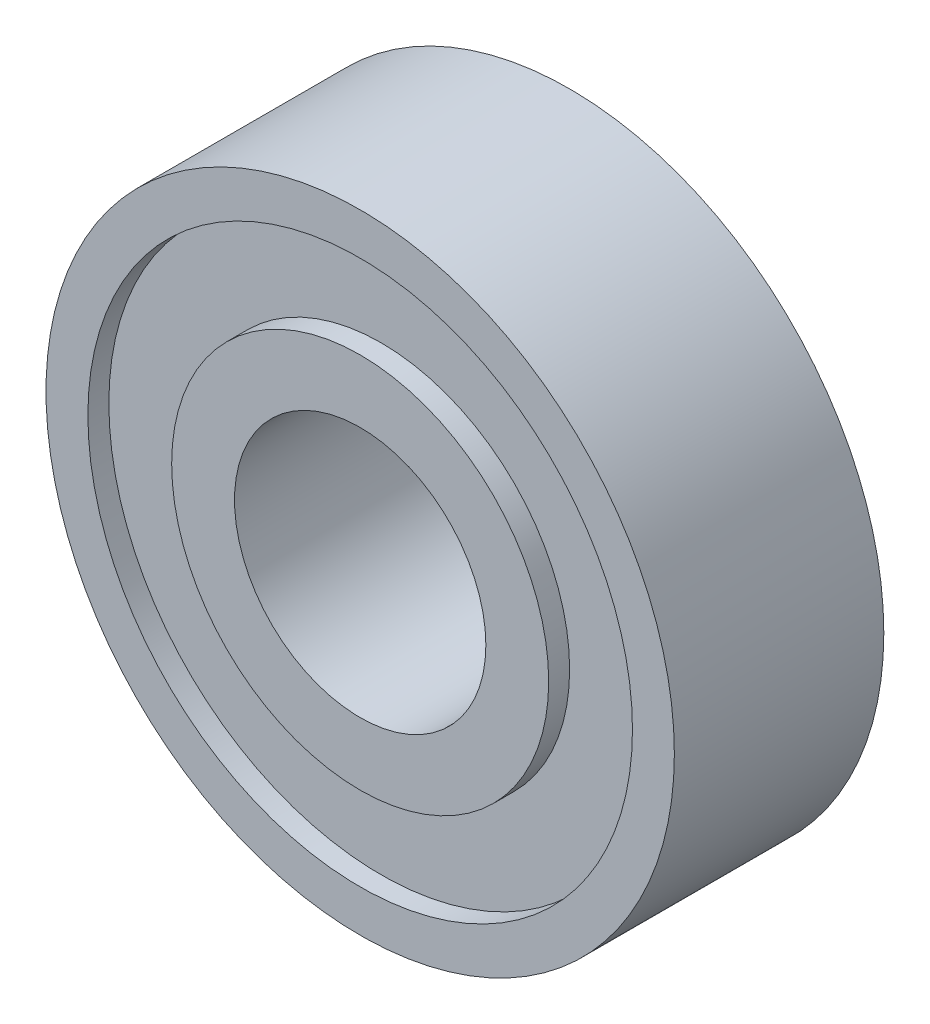
ISO-10303-21;
HEADER;
FILE_DESCRIPTION(('STEP AP214'),'2;1');
FILE_NAME('part.step','',(''),(''),'','','');
FILE_SCHEMA(('AUTOMOTIVE_DESIGN { 1 0 10303 214 1 1 1 1 }'));
ENDSEC;
DATA;
#1=APPLICATION_CONTEXT('core data for automotive mechanical design processes');
#2=APPLICATION_PROTOCOL_DEFINITION('international standard','automotive_design',2000,#1);
#3=PRODUCT_CONTEXT('',#1,'mechanical');
#4=PRODUCT('Part','Part','',(#3));
#5=PRODUCT_RELATED_PRODUCT_CATEGORY('part','',(#4));
#6=PRODUCT_DEFINITION_FORMATION('','',#4);
#7=PRODUCT_DEFINITION_CONTEXT('part definition',#1,'design');
#8=PRODUCT_DEFINITION('design','',#6,#7);
#9=PRODUCT_DEFINITION_SHAPE('','',#8);
#10=(LENGTH_UNIT() NAMED_UNIT(*) SI_UNIT(.MILLI.,.METRE.));
#11=(NAMED_UNIT(*) PLANE_ANGLE_UNIT() SI_UNIT($,.RADIAN.));
#12=(NAMED_UNIT(*) SI_UNIT($,.STERADIAN.) SOLID_ANGLE_UNIT());
#13=UNCERTAINTY_MEASURE_WITH_UNIT(LENGTH_MEASURE(1.E-05),#10,'distance_accuracy_value','');
#14=(GEOMETRIC_REPRESENTATION_CONTEXT(3) GLOBAL_UNCERTAINTY_ASSIGNED_CONTEXT((#13)) GLOBAL_UNIT_ASSIGNED_CONTEXT((#10,
#11,#12)) REPRESENTATION_CONTEXT('',''));
#15=CARTESIAN_POINT('',(0.,0.,0.));
#16=DIRECTION('',(0.,0.,1.));
#17=DIRECTION('',(1.,0.,0.));
#18=AXIS2_PLACEMENT_3D('',#15,#16,#17);
#19=CARTESIAN_POINT('',(0.,0.,0.));
#20=DIRECTION('',(0.,0.,1.));
#21=DIRECTION('',(1.,0.,0.));
#22=AXIS2_PLACEMENT_3D('',#19,#20,#21);
#23=PLANE('',#22);
#24=CARTESIAN_POINT('',(0.,0.,0.));
#25=DIRECTION('',(0.,0.,1.));
#26=DIRECTION('',(1.,0.,0.));
#27=AXIS2_PLACEMENT_3D('',#24,#25,#26);
#28=CIRCLE('',#27,3.);
#29=CARTESIAN_POINT('',(3.,0.,0.));
#30=VERTEX_POINT('',#29);
#31=EDGE_CURVE('E64',#30,#30,#28,.T.);
#32=ORIENTED_EDGE('',*,*,#31,.T.);
#33=EDGE_LOOP('',(#32));
#34=FACE_BOUND('',#33,.T.);
#35=CARTESIAN_POINT('',(0.,0.,0.));
#36=DIRECTION('',(0.,0.,-1.));
#37=DIRECTION('',(-1.,0.,0.));
#38=AXIS2_PLACEMENT_3D('',#35,#36,#37);
#39=CIRCLE('',#38,4.5);
#40=CARTESIAN_POINT('',(-4.5,0.,0.));
#41=VERTEX_POINT('',#40);
#42=EDGE_CURVE('E96',#41,#41,#39,.T.);
#43=ORIENTED_EDGE('',*,*,#42,.T.);
#44=EDGE_LOOP('',(#43));
#45=FACE_BOUND('',#44,.T.);
#46=ADVANCED_FACE('F49',(#34,#45),#23,.F.);
#47=CARTESIAN_POINT('',(0.,0.,5.));
#48=DIRECTION('',(0.,0.,1.));
#49=DIRECTION('',(1.,0.,0.));
#50=AXIS2_PLACEMENT_3D('',#47,#48,#49);
#51=PLANE('',#50);
#52=CARTESIAN_POINT('',(0.,0.,5.));
#53=DIRECTION('',(0.,0.,1.));
#54=DIRECTION('',(1.,0.,0.));
#55=AXIS2_PLACEMENT_3D('',#52,#53,#54);
#56=CIRCLE('',#55,3.);
#57=CARTESIAN_POINT('',(3.,0.,5.));
#58=VERTEX_POINT('',#57);
#59=EDGE_CURVE('E62',#58,#58,#56,.T.);
#60=ORIENTED_EDGE('',*,*,#59,.F.);
#61=EDGE_LOOP('',(#60));
#62=FACE_BOUND('',#61,.T.);
#63=CARTESIAN_POINT('',(0.,0.,5.));
#64=DIRECTION('',(0.,0.,1.));
#65=DIRECTION('',(1.,0.,0.));
#66=AXIS2_PLACEMENT_3D('',#63,#64,#65);
#67=CIRCLE('',#66,4.5);
#68=CARTESIAN_POINT('',(4.5,0.,5.));
#69=VERTEX_POINT('',#68);
#70=EDGE_CURVE('E80',#69,#69,#67,.T.);
#71=ORIENTED_EDGE('',*,*,#70,.T.);
#72=EDGE_LOOP('',(#71));
#73=FACE_BOUND('',#72,.T.);
#74=ADVANCED_FACE('F136',(#62,#73),#51,.T.);
#75=CARTESIAN_POINT('',(0.,0.,5.));
#76=DIRECTION('',(0.,0.,1.));
#77=DIRECTION('',(1.,0.,0.));
#78=AXIS2_PLACEMENT_3D('',#75,#76,#77);
#79=CIRCLE('',#78,6.5);
#80=CARTESIAN_POINT('',(6.5,0.,5.));
#81=VERTEX_POINT('',#80);
#82=EDGE_CURVE('E72',#81,#81,#79,.T.);
#83=ORIENTED_EDGE('',*,*,#82,.F.);
#84=EDGE_LOOP('',(#83));
#85=FACE_BOUND('',#84,.T.);
#86=CARTESIAN_POINT('',(0.,0.,5.));
#87=DIRECTION('',(0.,0.,1.));
#88=DIRECTION('',(1.,0.,0.));
#89=AXIS2_PLACEMENT_3D('',#86,#87,#88);
#90=CIRCLE('',#89,7.5);
#91=CARTESIAN_POINT('',(7.5,0.,5.));
#92=VERTEX_POINT('',#91);
#93=EDGE_CURVE('E10',#92,#92,#90,.T.);
#94=ORIENTED_EDGE('',*,*,#93,.T.);
#95=EDGE_LOOP('',(#94));
#96=FACE_BOUND('',#95,.T.);
#97=ADVANCED_FACE('F123',(#85,#96),#51,.T.);
#98=CARTESIAN_POINT('',(0.,0.,0.));
#99=DIRECTION('',(0.,0.,-1.));
#100=DIRECTION('',(-1.,0.,0.));
#101=AXIS2_PLACEMENT_3D('',#98,#99,#100);
#102=CIRCLE('',#101,6.5);
#103=CARTESIAN_POINT('',(-6.5,0.,0.));
#104=VERTEX_POINT('',#103);
#105=EDGE_CURVE('E88',#104,#104,#102,.T.);
#106=ORIENTED_EDGE('',*,*,#105,.F.);
#107=EDGE_LOOP('',(#106));
#108=FACE_BOUND('',#107,.T.);
#109=CARTESIAN_POINT('',(0.,0.,0.));
#110=DIRECTION('',(0.,0.,1.));
#111=DIRECTION('',(1.,0.,0.));
#112=AXIS2_PLACEMENT_3D('',#109,#110,#111);
#113=CIRCLE('',#112,7.5);
#114=CARTESIAN_POINT('',(7.5,0.,0.));
#115=VERTEX_POINT('',#114);
#116=EDGE_CURVE('E53',#115,#115,#113,.T.);
#117=ORIENTED_EDGE('',*,*,#116,.F.);
#118=EDGE_LOOP('',(#117));
#119=FACE_BOUND('',#118,.T.);
#120=ADVANCED_FACE('F120',(#108,#119),#23,.F.);
#121=CARTESIAN_POINT('',(0.,0.,5.));
#122=DIRECTION('',(0.,0.,-1.));
#123=DIRECTION('',(-1.,0.,0.));
#124=AXIS2_PLACEMENT_3D('',#121,#122,#123);
#125=CYLINDRICAL_SURFACE('',#124,7.5);
#126=ORIENTED_EDGE('',*,*,#93,.F.);
#127=EDGE_LOOP('',(#126));
#128=FACE_BOUND('',#127,.T.);
#129=ORIENTED_EDGE('',*,*,#116,.T.);
#130=EDGE_LOOP('',(#129));
#131=FACE_BOUND('',#130,.T.);
#132=ADVANCED_FACE('F51',(#128,#131),#125,.T.);
#133=CARTESIAN_POINT('',(0.,0.,5.));
#134=DIRECTION('',(0.,0.,-1.));
#135=DIRECTION('',(-1.,0.,0.));
#136=AXIS2_PLACEMENT_3D('',#133,#134,#135);
#137=CYLINDRICAL_SURFACE('',#136,3.);
#138=ORIENTED_EDGE('',*,*,#59,.T.);
#139=EDGE_LOOP('',(#138));
#140=FACE_BOUND('',#139,.T.);
#141=ORIENTED_EDGE('',*,*,#31,.F.);
#142=EDGE_LOOP('',(#141));
#143=FACE_BOUND('',#142,.T.);
#144=ADVANCED_FACE('F127',(#140,#143),#137,.F.);
#145=CARTESIAN_POINT('',(0.,0.,4.5));
#146=DIRECTION('',(0.,0.,1.));
#147=DIRECTION('',(1.,0.,0.));
#148=AXIS2_PLACEMENT_3D('',#145,#146,#147);
#149=CYLINDRICAL_SURFACE('',#148,6.5);
#150=CARTESIAN_POINT('',(0.,0.,4.5));
#151=DIRECTION('',(0.,0.,1.));
#152=DIRECTION('',(1.,0.,0.));
#153=AXIS2_PLACEMENT_3D('',#150,#151,#152);
#154=CIRCLE('',#153,6.5);
#155=CARTESIAN_POINT('',(6.5,0.,4.5));
#156=VERTEX_POINT('',#155);
#157=EDGE_CURVE('E68',#156,#156,#154,.T.);
#158=ORIENTED_EDGE('',*,*,#157,.F.);
#159=EDGE_LOOP('',(#158));
#160=FACE_BOUND('',#159,.T.);
#161=ORIENTED_EDGE('',*,*,#82,.T.);
#162=EDGE_LOOP('',(#161));
#163=FACE_BOUND('',#162,.T.);
#164=ADVANCED_FACE('F132',(#160,#163),#149,.F.);
#165=CARTESIAN_POINT('',(0.,0.,4.5));
#166=DIRECTION('',(0.,0.,1.));
#167=DIRECTION('',(1.,0.,0.));
#168=AXIS2_PLACEMENT_3D('',#165,#166,#167);
#169=PLANE('',#168);
#170=CARTESIAN_POINT('',(0.,0.,4.5));
#171=DIRECTION('',(0.,0.,1.));
#172=DIRECTION('',(1.,0.,0.));
#173=AXIS2_PLACEMENT_3D('',#170,#171,#172);
#174=CIRCLE('',#173,4.5);
#175=CARTESIAN_POINT('',(4.5,0.,4.5));
#176=VERTEX_POINT('',#175);
#177=EDGE_CURVE('E76',#176,#176,#174,.T.);
#178=ORIENTED_EDGE('',*,*,#177,.F.);
#179=EDGE_LOOP('',(#178));
#180=FACE_BOUND('',#179,.T.);
#181=ORIENTED_EDGE('',*,*,#157,.T.);
#182=EDGE_LOOP('',(#181));
#183=FACE_BOUND('',#182,.T.);
#184=ADVANCED_FACE('F150',(#180,#183),#169,.T.);
#185=CARTESIAN_POINT('',(0.,0.,4.5));
#186=DIRECTION('',(0.,0.,1.));
#187=DIRECTION('',(1.,0.,0.));
#188=AXIS2_PLACEMENT_3D('',#185,#186,#187);
#189=CYLINDRICAL_SURFACE('',#188,4.5);
#190=ORIENTED_EDGE('',*,*,#177,.T.);
#191=EDGE_LOOP('',(#190));
#192=FACE_BOUND('',#191,.T.);
#193=ORIENTED_EDGE('',*,*,#70,.F.);
#194=EDGE_LOOP('',(#193));
#195=FACE_BOUND('',#194,.T.);
#196=ADVANCED_FACE('F116',(#192,#195),#189,.T.);
#197=CARTESIAN_POINT('',(0.,0.,0.5));
#198=DIRECTION('',(0.,0.,-1.));
#199=DIRECTION('',(-1.,0.,0.));
#200=AXIS2_PLACEMENT_3D('',#197,#198,#199);
#201=CYLINDRICAL_SURFACE('',#200,6.5);
#202=CARTESIAN_POINT('',(0.,0.,0.5));
#203=DIRECTION('',(0.,0.,-1.));
#204=DIRECTION('',(-1.,0.,0.));
#205=AXIS2_PLACEMENT_3D('',#202,#203,#204);
#206=CIRCLE('',#205,6.5);
#207=CARTESIAN_POINT('',(-6.5,0.,0.5));
#208=VERTEX_POINT('',#207);
#209=EDGE_CURVE('E84',#208,#208,#206,.T.);
#210=ORIENTED_EDGE('',*,*,#209,.F.);
#211=EDGE_LOOP('',(#210));
#212=FACE_BOUND('',#211,.T.);
#213=ORIENTED_EDGE('',*,*,#105,.T.);
#214=EDGE_LOOP('',(#213));
#215=FACE_BOUND('',#214,.T.);
#216=ADVANCED_FACE('F110',(#212,#215),#201,.F.);
#217=CARTESIAN_POINT('',(0.,0.,0.5));
#218=DIRECTION('',(0.,0.,-1.));
#219=DIRECTION('',(-1.,0.,0.));
#220=AXIS2_PLACEMENT_3D('',#217,#218,#219);
#221=PLANE('',#220);
#222=CARTESIAN_POINT('',(0.,0.,0.5));
#223=DIRECTION('',(0.,0.,-1.));
#224=DIRECTION('',(-1.,0.,0.));
#225=AXIS2_PLACEMENT_3D('',#222,#223,#224);
#226=CIRCLE('',#225,4.5);
#227=CARTESIAN_POINT('',(-4.5,0.,0.5));
#228=VERTEX_POINT('',#227);
#229=EDGE_CURVE('E92',#228,#228,#226,.T.);
#230=ORIENTED_EDGE('',*,*,#229,.F.);
#231=EDGE_LOOP('',(#230));
#232=FACE_BOUND('',#231,.T.);
#233=ORIENTED_EDGE('',*,*,#209,.T.);
#234=EDGE_LOOP('',(#233));
#235=FACE_BOUND('',#234,.T.);
#236=ADVANCED_FACE('F107',(#232,#235),#221,.T.);
#237=CARTESIAN_POINT('',(0.,0.,0.5));
#238=DIRECTION('',(0.,0.,-1.));
#239=DIRECTION('',(-1.,0.,0.));
#240=AXIS2_PLACEMENT_3D('',#237,#238,#239);
#241=CYLINDRICAL_SURFACE('',#240,4.5);
#242=ORIENTED_EDGE('',*,*,#229,.T.);
#243=EDGE_LOOP('',(#242));
#244=FACE_BOUND('',#243,.T.);
#245=ORIENTED_EDGE('',*,*,#42,.F.);
#246=EDGE_LOOP('',(#245));
#247=FACE_BOUND('',#246,.T.);
#248=ADVANCED_FACE('F104',(#244,#247),#241,.T.);
#249=CLOSED_SHELL('',(#46,#74,#97,#120,#132,#144,#164,#184,#196,#216,#236,#248));
#250=MANIFOLD_SOLID_BREP('B2',#249);
#251=ADVANCED_BREP_SHAPE_REPRESENTATION('',(#18,#250),#14);
#252=SHAPE_DEFINITION_REPRESENTATION(#9,#251);
ENDSEC;
END-ISO-10303-21;
